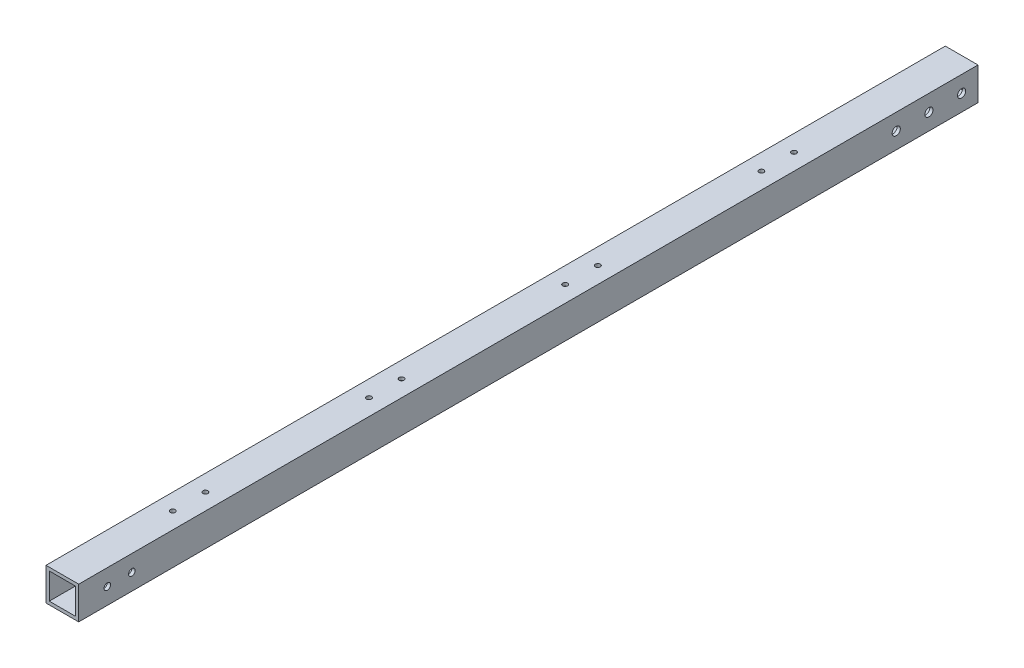
ISO-10303-21;
HEADER;
FILE_DESCRIPTION(('STEP AP214'),'2;1');
FILE_NAME('part.step','',(''),(''),'','','');
FILE_SCHEMA(('AUTOMOTIVE_DESIGN { 1 0 10303 214 1 1 1 1 }'));
ENDSEC;
DATA;
#1=APPLICATION_CONTEXT('core data for automotive mechanical design processes');
#2=APPLICATION_PROTOCOL_DEFINITION('international standard','automotive_design',2000,#1);
#3=PRODUCT_CONTEXT('',#1,'mechanical');
#4=PRODUCT('Part','Part','',(#3));
#5=PRODUCT_RELATED_PRODUCT_CATEGORY('part','',(#4));
#6=PRODUCT_DEFINITION_FORMATION('','',#4);
#7=PRODUCT_DEFINITION_CONTEXT('part definition',#1,'design');
#8=PRODUCT_DEFINITION('design','',#6,#7);
#9=PRODUCT_DEFINITION_SHAPE('','',#8);
#10=(LENGTH_UNIT() NAMED_UNIT(*) SI_UNIT(.MILLI.,.METRE.));
#11=(NAMED_UNIT(*) PLANE_ANGLE_UNIT() SI_UNIT($,.RADIAN.));
#12=(NAMED_UNIT(*) SI_UNIT($,.STERADIAN.) SOLID_ANGLE_UNIT());
#13=UNCERTAINTY_MEASURE_WITH_UNIT(LENGTH_MEASURE(1.E-05),#10,'distance_accuracy_value','');
#14=(GEOMETRIC_REPRESENTATION_CONTEXT(3) GLOBAL_UNCERTAINTY_ASSIGNED_CONTEXT((#13)) GLOBAL_UNIT_ASSIGNED_CONTEXT((#10,
#11,#12)) REPRESENTATION_CONTEXT('',''));
#15=CARTESIAN_POINT('',(0.,0.,0.));
#16=DIRECTION('',(0.,0.,1.));
#17=DIRECTION('',(1.,0.,0.));
#18=AXIS2_PLACEMENT_3D('',#15,#16,#17);
#19=CARTESIAN_POINT('',(0.,0.,550.));
#20=DIRECTION('',(0.,0.,-1.));
#21=DIRECTION('',(-1.,0.,0.));
#22=AXIS2_PLACEMENT_3D('',#19,#20,#21);
#23=PLANE('',#22);
#24=DIRECTION('',(0.,1.,0.));
#25=VECTOR('',#24,1.);
#26=CARTESIAN_POINT('',(10.,-10.,550.));
#27=LINE('',#26,#25);
#28=CARTESIAN_POINT('',(10.,-10.,550.));
#29=VERTEX_POINT('',#28);
#30=CARTESIAN_POINT('',(10.,10.,550.));
#31=VERTEX_POINT('',#30);
#32=EDGE_CURVE('E156',#29,#31,#27,.T.);
#33=ORIENTED_EDGE('',*,*,#32,.T.);
#34=DIRECTION('',(-1.,0.,0.));
#35=VECTOR('',#34,1.);
#36=CARTESIAN_POINT('',(-10.,10.,550.));
#37=LINE('',#36,#35);
#38=CARTESIAN_POINT('',(-10.,10.,550.));
#39=VERTEX_POINT('',#38);
#40=EDGE_CURVE('E160',#31,#39,#37,.T.);
#41=ORIENTED_EDGE('',*,*,#40,.T.);
#42=DIRECTION('',(0.,-1.,0.));
#43=VECTOR('',#42,1.);
#44=CARTESIAN_POINT('',(-10.,-10.,550.));
#45=LINE('',#44,#43);
#46=CARTESIAN_POINT('',(-10.,-10.,550.));
#47=VERTEX_POINT('',#46);
#48=EDGE_CURVE('E164',#39,#47,#45,.T.);
#49=ORIENTED_EDGE('',*,*,#48,.T.);
#50=DIRECTION('',(1.,0.,0.));
#51=VECTOR('',#50,1.);
#52=CARTESIAN_POINT('',(-10.,-10.,550.));
#53=LINE('',#52,#51);
#54=EDGE_CURVE('E167',#47,#29,#53,.T.);
#55=ORIENTED_EDGE('',*,*,#54,.T.);
#56=EDGE_LOOP('',(#33,#41,#49,#55));
#57=FACE_BOUND('',#56,.T.);
#58=DIRECTION('',(0.,1.,0.));
#59=VECTOR('',#58,1.);
#60=CARTESIAN_POINT('',(8.,-8.,550.));
#61=LINE('',#60,#59);
#62=CARTESIAN_POINT('',(8.,-8.,550.));
#63=VERTEX_POINT('',#62);
#64=CARTESIAN_POINT('',(8.,8.,550.));
#65=VERTEX_POINT('',#64);
#66=EDGE_CURVE('E106',#63,#65,#61,.T.);
#67=ORIENTED_EDGE('',*,*,#66,.F.);
#68=DIRECTION('',(1.,0.,0.));
#69=VECTOR('',#68,1.);
#70=CARTESIAN_POINT('',(-8.,-8.,550.));
#71=LINE('',#70,#69);
#72=CARTESIAN_POINT('',(-8.,-8.,550.));
#73=VERTEX_POINT('',#72);
#74=EDGE_CURVE('E132',#73,#63,#71,.T.);
#75=ORIENTED_EDGE('',*,*,#74,.F.);
#76=DIRECTION('',(0.,-1.,0.));
#77=VECTOR('',#76,1.);
#78=CARTESIAN_POINT('',(-8.,-8.,550.));
#79=LINE('',#78,#77);
#80=CARTESIAN_POINT('',(-8.,8.,550.));
#81=VERTEX_POINT('',#80);
#82=EDGE_CURVE('E128',#81,#73,#79,.T.);
#83=ORIENTED_EDGE('',*,*,#82,.F.);
#84=DIRECTION('',(-1.,0.,0.));
#85=VECTOR('',#84,1.);
#86=CARTESIAN_POINT('',(-8.,8.,550.));
#87=LINE('',#86,#85);
#88=EDGE_CURVE('E115',#65,#81,#87,.T.);
#89=ORIENTED_EDGE('',*,*,#88,.F.);
#90=EDGE_LOOP('',(#67,#75,#83,#89));
#91=FACE_BOUND('',#90,.T.);
#92=ADVANCED_FACE('F38',(#57,#91),#23,.F.);
#93=CARTESIAN_POINT('',(0.,0.,0.));
#94=DIRECTION('',(0.,0.,-1.));
#95=DIRECTION('',(-1.,0.,0.));
#96=AXIS2_PLACEMENT_3D('',#93,#94,#95);
#97=PLANE('',#96);
#98=DIRECTION('',(0.,1.,0.));
#99=VECTOR('',#98,1.);
#100=CARTESIAN_POINT('',(10.,-10.,0.));
#101=LINE('',#100,#99);
#102=CARTESIAN_POINT('',(10.,-10.,0.));
#103=VERTEX_POINT('',#102);
#104=CARTESIAN_POINT('',(10.,10.,0.));
#105=VERTEX_POINT('',#104);
#106=EDGE_CURVE('E124',#103,#105,#101,.T.);
#107=ORIENTED_EDGE('',*,*,#106,.F.);
#108=DIRECTION('',(1.,0.,0.));
#109=VECTOR('',#108,1.);
#110=CARTESIAN_POINT('',(-10.,-10.,0.));
#111=LINE('',#110,#109);
#112=CARTESIAN_POINT('',(-10.,-10.,0.));
#113=VERTEX_POINT('',#112);
#114=EDGE_CURVE('E161',#113,#103,#111,.T.);
#115=ORIENTED_EDGE('',*,*,#114,.F.);
#116=DIRECTION('',(0.,-1.,0.));
#117=VECTOR('',#116,1.);
#118=CARTESIAN_POINT('',(-10.,-10.,0.));
#119=LINE('',#118,#117);
#120=CARTESIAN_POINT('',(-10.,10.,0.));
#121=VERTEX_POINT('',#120);
#122=EDGE_CURVE('E177',#121,#113,#119,.T.);
#123=ORIENTED_EDGE('',*,*,#122,.F.);
#124=DIRECTION('',(-1.,0.,0.));
#125=VECTOR('',#124,1.);
#126=CARTESIAN_POINT('',(-10.,10.,0.));
#127=LINE('',#126,#125);
#128=EDGE_CURVE('E174',#105,#121,#127,.T.);
#129=ORIENTED_EDGE('',*,*,#128,.F.);
#130=EDGE_LOOP('',(#107,#115,#123,#129));
#131=FACE_BOUND('',#130,.T.);
#132=DIRECTION('',(1.,0.,0.));
#133=VECTOR('',#132,1.);
#134=CARTESIAN_POINT('',(-8.,-8.,0.));
#135=LINE('',#134,#133);
#136=CARTESIAN_POINT('',(-8.,-8.,0.));
#137=VERTEX_POINT('',#136);
#138=CARTESIAN_POINT('',(8.,-8.,0.));
#139=VERTEX_POINT('',#138);
#140=EDGE_CURVE('E116',#137,#139,#135,.T.);
#141=ORIENTED_EDGE('',*,*,#140,.T.);
#142=DIRECTION('',(0.,1.,0.));
#143=VECTOR('',#142,1.);
#144=CARTESIAN_POINT('',(8.,-8.,0.));
#145=LINE('',#144,#143);
#146=CARTESIAN_POINT('',(8.,8.,0.));
#147=VERTEX_POINT('',#146);
#148=EDGE_CURVE('E64',#139,#147,#145,.T.);
#149=ORIENTED_EDGE('',*,*,#148,.T.);
#150=DIRECTION('',(-1.,0.,0.));
#151=VECTOR('',#150,1.);
#152=CARTESIAN_POINT('',(-8.,8.,0.));
#153=LINE('',#152,#151);
#154=CARTESIAN_POINT('',(-8.,8.,0.));
#155=VERTEX_POINT('',#154);
#156=EDGE_CURVE('E122',#147,#155,#153,.T.);
#157=ORIENTED_EDGE('',*,*,#156,.T.);
#158=DIRECTION('',(0.,-1.,0.));
#159=VECTOR('',#158,1.);
#160=CARTESIAN_POINT('',(-8.,-8.,0.));
#161=LINE('',#160,#159);
#162=EDGE_CURVE('E143',#155,#137,#161,.T.);
#163=ORIENTED_EDGE('',*,*,#162,.T.);
#164=EDGE_LOOP('',(#141,#149,#157,#163));
#165=FACE_BOUND('',#164,.T.);
#166=ADVANCED_FACE('F343',(#131,#165),#97,.T.);
#167=CARTESIAN_POINT('',(10.,-10.,550.));
#168=DIRECTION('',(-1.,0.,0.));
#169=DIRECTION('',(0.,0.,1.));
#170=AXIS2_PLACEMENT_3D('',#167,#168,#169);
#171=PLANE('',#170);
#172=CARTESIAN_POINT('',(10.,0.,10.));
#173=DIRECTION('',(-1.,0.,0.));
#174=DIRECTION('',(0.,0.,1.));
#175=AXIS2_PLACEMENT_3D('',#172,#173,#174);
#176=CIRCLE('',#175,2.5);
#177=CARTESIAN_POINT('',(10.,0.,12.5));
#178=VERTEX_POINT('',#177);
#179=EDGE_CURVE('E207',#178,#178,#176,.T.);
#180=ORIENTED_EDGE('',*,*,#179,.T.);
#181=EDGE_LOOP('',(#180));
#182=FACE_BOUND('',#181,.T.);
#183=CARTESIAN_POINT('',(10.,0.,30.));
#184=DIRECTION('',(-1.,0.,0.));
#185=DIRECTION('',(0.,0.,1.));
#186=AXIS2_PLACEMENT_3D('',#183,#184,#185);
#187=CIRCLE('',#186,2.5);
#188=CARTESIAN_POINT('',(10.,0.,32.5));
#189=VERTEX_POINT('',#188);
#190=EDGE_CURVE('E277',#189,#189,#187,.T.);
#191=ORIENTED_EDGE('',*,*,#190,.T.);
#192=EDGE_LOOP('',(#191));
#193=FACE_BOUND('',#192,.T.);
#194=CARTESIAN_POINT('',(10.,0.,50.));
#195=DIRECTION('',(-1.,0.,0.));
#196=DIRECTION('',(0.,0.,1.));
#197=AXIS2_PLACEMENT_3D('',#194,#195,#196);
#198=CIRCLE('',#197,2.5);
#199=CARTESIAN_POINT('',(10.,0.,52.5));
#200=VERTEX_POINT('',#199);
#201=EDGE_CURVE('E285',#200,#200,#198,.T.);
#202=ORIENTED_EDGE('',*,*,#201,.T.);
#203=EDGE_LOOP('',(#202));
#204=FACE_BOUND('',#203,.T.);
#205=CARTESIAN_POINT('',(10.,0.,532.5));
#206=DIRECTION('',(-1.,0.,0.));
#207=DIRECTION('',(0.,0.,1.));
#208=AXIS2_PLACEMENT_3D('',#205,#206,#207);
#209=CIRCLE('',#208,2.);
#210=CARTESIAN_POINT('',(10.,0.,534.5));
#211=VERTEX_POINT('',#210);
#212=EDGE_CURVE('E197',#211,#211,#209,.T.);
#213=ORIENTED_EDGE('',*,*,#212,.T.);
#214=EDGE_LOOP('',(#213));
#215=FACE_BOUND('',#214,.T.);
#216=CARTESIAN_POINT('',(10.,0.,517.5));
#217=DIRECTION('',(-1.,0.,0.));
#218=DIRECTION('',(0.,0.,1.));
#219=AXIS2_PLACEMENT_3D('',#216,#217,#218);
#220=CIRCLE('',#219,2.);
#221=CARTESIAN_POINT('',(10.,0.,519.5));
#222=VERTEX_POINT('',#221);
#223=EDGE_CURVE('E309',#222,#222,#220,.T.);
#224=ORIENTED_EDGE('',*,*,#223,.T.);
#225=EDGE_LOOP('',(#224));
#226=FACE_BOUND('',#225,.T.);
#227=ORIENTED_EDGE('',*,*,#106,.T.);
#228=DIRECTION('',(0.,0.,-1.));
#229=VECTOR('',#228,1.);
#230=CARTESIAN_POINT('',(10.,10.,550.));
#231=LINE('',#230,#229);
#232=EDGE_CURVE('E11',#31,#105,#231,.T.);
#233=ORIENTED_EDGE('',*,*,#232,.F.);
#234=ORIENTED_EDGE('',*,*,#32,.F.);
#235=DIRECTION('',(0.,0.,-1.));
#236=VECTOR('',#235,1.);
#237=CARTESIAN_POINT('',(10.,-10.,550.));
#238=LINE('',#237,#236);
#239=EDGE_CURVE('E170',#29,#103,#238,.T.);
#240=ORIENTED_EDGE('',*,*,#239,.T.);
#241=EDGE_LOOP('',(#227,#233,#234,#240));
#242=FACE_BOUND('',#241,.T.);
#243=ADVANCED_FACE('F40',(#182,#193,#204,#215,#226,#242),#171,.F.);
#244=CARTESIAN_POINT('',(-10.,10.,550.));
#245=DIRECTION('',(0.,-1.,0.));
#246=DIRECTION('',(0.,0.,-1.));
#247=AXIS2_PLACEMENT_3D('',#244,#245,#246);
#248=PLANE('',#247);
#249=CARTESIAN_POINT('',(0.,10.,482.5));
#250=DIRECTION('',(0.,-1.,0.));
#251=DIRECTION('',(0.,0.,-1.));
#252=AXIS2_PLACEMENT_3D('',#249,#250,#251);
#253=CIRCLE('',#252,1.5);
#254=CARTESIAN_POINT('',(0.,10.,481.));
#255=VERTEX_POINT('',#254);
#256=EDGE_CURVE('E223',#255,#255,#253,.T.);
#257=ORIENTED_EDGE('',*,*,#256,.T.);
#258=EDGE_LOOP('',(#257));
#259=FACE_BOUND('',#258,.T.);
#260=CARTESIAN_POINT('',(0.,10.,462.5));
#261=DIRECTION('',(0.,-1.,0.));
#262=DIRECTION('',(0.,0.,-1.));
#263=AXIS2_PLACEMENT_3D('',#260,#261,#262);
#264=CIRCLE('',#263,1.5);
#265=CARTESIAN_POINT('',(0.,10.,461.));
#266=VERTEX_POINT('',#265);
#267=EDGE_CURVE('E471',#266,#266,#264,.T.);
#268=ORIENTED_EDGE('',*,*,#267,.T.);
#269=EDGE_LOOP('',(#268));
#270=FACE_BOUND('',#269,.T.);
#271=CARTESIAN_POINT('',(0.,10.,362.5));
#272=DIRECTION('',(0.,-1.,0.));
#273=DIRECTION('',(0.,0.,-1.));
#274=AXIS2_PLACEMENT_3D('',#271,#272,#273);
#275=CIRCLE('',#274,1.5);
#276=CARTESIAN_POINT('',(0.,10.,361.));
#277=VERTEX_POINT('',#276);
#278=EDGE_CURVE('E481',#277,#277,#275,.T.);
#279=ORIENTED_EDGE('',*,*,#278,.T.);
#280=EDGE_LOOP('',(#279));
#281=FACE_BOUND('',#280,.T.);
#282=CARTESIAN_POINT('',(0.,10.,342.5));
#283=DIRECTION('',(0.,-1.,0.));
#284=DIRECTION('',(0.,0.,-1.));
#285=AXIS2_PLACEMENT_3D('',#282,#283,#284);
#286=CIRCLE('',#285,1.5);
#287=CARTESIAN_POINT('',(0.,10.,341.));
#288=VERTEX_POINT('',#287);
#289=EDGE_CURVE('E489',#288,#288,#286,.T.);
#290=ORIENTED_EDGE('',*,*,#289,.T.);
#291=EDGE_LOOP('',(#290));
#292=FACE_BOUND('',#291,.T.);
#293=CARTESIAN_POINT('',(0.,10.,242.5));
#294=DIRECTION('',(0.,-1.,0.));
#295=DIRECTION('',(0.,0.,-1.));
#296=AXIS2_PLACEMENT_3D('',#293,#294,#295);
#297=CIRCLE('',#296,1.5);
#298=CARTESIAN_POINT('',(0.,10.,241.));
#299=VERTEX_POINT('',#298);
#300=EDGE_CURVE('E497',#299,#299,#297,.T.);
#301=ORIENTED_EDGE('',*,*,#300,.T.);
#302=EDGE_LOOP('',(#301));
#303=FACE_BOUND('',#302,.T.);
#304=CARTESIAN_POINT('',(0.,10.,222.5));
#305=DIRECTION('',(0.,-1.,0.));
#306=DIRECTION('',(0.,0.,-1.));
#307=AXIS2_PLACEMENT_3D('',#304,#305,#306);
#308=CIRCLE('',#307,1.5);
#309=CARTESIAN_POINT('',(0.,10.,221.));
#310=VERTEX_POINT('',#309);
#311=EDGE_CURVE('E505',#310,#310,#308,.T.);
#312=ORIENTED_EDGE('',*,*,#311,.T.);
#313=EDGE_LOOP('',(#312));
#314=FACE_BOUND('',#313,.T.);
#315=CARTESIAN_POINT('',(0.,10.,122.5));
#316=DIRECTION('',(0.,-1.,0.));
#317=DIRECTION('',(0.,0.,-1.));
#318=AXIS2_PLACEMENT_3D('',#315,#316,#317);
#319=CIRCLE('',#318,1.5);
#320=CARTESIAN_POINT('',(0.,10.,121.));
#321=VERTEX_POINT('',#320);
#322=EDGE_CURVE('E513',#321,#321,#319,.T.);
#323=ORIENTED_EDGE('',*,*,#322,.T.);
#324=EDGE_LOOP('',(#323));
#325=FACE_BOUND('',#324,.T.);
#326=CARTESIAN_POINT('',(0.,10.,102.5));
#327=DIRECTION('',(0.,-1.,0.));
#328=DIRECTION('',(0.,0.,-1.));
#329=AXIS2_PLACEMENT_3D('',#326,#327,#328);
#330=CIRCLE('',#329,1.5);
#331=CARTESIAN_POINT('',(0.,10.,101.));
#332=VERTEX_POINT('',#331);
#333=EDGE_CURVE('E521',#332,#332,#330,.T.);
#334=ORIENTED_EDGE('',*,*,#333,.T.);
#335=EDGE_LOOP('',(#334));
#336=FACE_BOUND('',#335,.T.);
#337=ORIENTED_EDGE('',*,*,#128,.T.);
#338=DIRECTION('',(0.,0.,-1.));
#339=VECTOR('',#338,1.);
#340=CARTESIAN_POINT('',(-10.,10.,550.));
#341=LINE('',#340,#339);
#342=EDGE_CURVE('E48',#39,#121,#341,.T.);
#343=ORIENTED_EDGE('',*,*,#342,.F.);
#344=ORIENTED_EDGE('',*,*,#40,.F.);
#345=ORIENTED_EDGE('',*,*,#232,.T.);
#346=EDGE_LOOP('',(#337,#343,#344,#345));
#347=FACE_BOUND('',#346,.T.);
#348=ADVANCED_FACE('F342',(#259,#270,#281,#292,#303,#314,#325,#336,#347),#248,.F.);
#349=CARTESIAN_POINT('',(-10.,-10.,550.));
#350=DIRECTION('',(1.,0.,0.));
#351=DIRECTION('',(0.,0.,-1.));
#352=AXIS2_PLACEMENT_3D('',#349,#350,#351);
#353=PLANE('',#352);
#354=CARTESIAN_POINT('',(-10.,0.,10.));
#355=DIRECTION('',(-1.,0.,0.));
#356=DIRECTION('',(0.,0.,1.));
#357=AXIS2_PLACEMENT_3D('',#354,#355,#356);
#358=CIRCLE('',#357,2.5);
#359=CARTESIAN_POINT('',(-10.,0.,12.5));
#360=VERTEX_POINT('',#359);
#361=EDGE_CURVE('E273',#360,#360,#358,.T.);
#362=ORIENTED_EDGE('',*,*,#361,.F.);
#363=EDGE_LOOP('',(#362));
#364=FACE_BOUND('',#363,.T.);
#365=CARTESIAN_POINT('',(-10.,0.,30.));
#366=DIRECTION('',(-1.,0.,0.));
#367=DIRECTION('',(0.,0.,1.));
#368=AXIS2_PLACEMENT_3D('',#365,#366,#367);
#369=CIRCLE('',#368,2.5);
#370=CARTESIAN_POINT('',(-10.,0.,32.5));
#371=VERTEX_POINT('',#370);
#372=EDGE_CURVE('E281',#371,#371,#369,.T.);
#373=ORIENTED_EDGE('',*,*,#372,.F.);
#374=EDGE_LOOP('',(#373));
#375=FACE_BOUND('',#374,.T.);
#376=CARTESIAN_POINT('',(-10.,0.,50.));
#377=DIRECTION('',(-1.,0.,0.));
#378=DIRECTION('',(0.,0.,1.));
#379=AXIS2_PLACEMENT_3D('',#376,#377,#378);
#380=CIRCLE('',#379,2.5);
#381=CARTESIAN_POINT('',(-10.,0.,52.5));
#382=VERTEX_POINT('',#381);
#383=EDGE_CURVE('E269',#382,#382,#380,.T.);
#384=ORIENTED_EDGE('',*,*,#383,.F.);
#385=EDGE_LOOP('',(#384));
#386=FACE_BOUND('',#385,.T.);
#387=CARTESIAN_POINT('',(-10.,0.,532.5));
#388=DIRECTION('',(-1.,0.,0.));
#389=DIRECTION('',(0.,0.,1.));
#390=AXIS2_PLACEMENT_3D('',#387,#388,#389);
#391=CIRCLE('',#390,2.);
#392=CARTESIAN_POINT('',(-10.,0.,534.5));
#393=VERTEX_POINT('',#392);
#394=EDGE_CURVE('E305',#393,#393,#391,.T.);
#395=ORIENTED_EDGE('',*,*,#394,.F.);
#396=EDGE_LOOP('',(#395));
#397=FACE_BOUND('',#396,.T.);
#398=CARTESIAN_POINT('',(-10.,0.,517.5));
#399=DIRECTION('',(-1.,0.,0.));
#400=DIRECTION('',(0.,0.,1.));
#401=AXIS2_PLACEMENT_3D('',#398,#399,#400);
#402=CIRCLE('',#401,2.);
#403=CARTESIAN_POINT('',(-10.,0.,519.5));
#404=VERTEX_POINT('',#403);
#405=EDGE_CURVE('E301',#404,#404,#402,.T.);
#406=ORIENTED_EDGE('',*,*,#405,.F.);
#407=EDGE_LOOP('',(#406));
#408=FACE_BOUND('',#407,.T.);
#409=ORIENTED_EDGE('',*,*,#122,.T.);
#410=DIRECTION('',(0.,0.,-1.));
#411=VECTOR('',#410,1.);
#412=CARTESIAN_POINT('',(-10.,-10.,550.));
#413=LINE('',#412,#411);
#414=EDGE_CURVE('E185',#47,#113,#413,.T.);
#415=ORIENTED_EDGE('',*,*,#414,.F.);
#416=ORIENTED_EDGE('',*,*,#48,.F.);
#417=ORIENTED_EDGE('',*,*,#342,.T.);
#418=EDGE_LOOP('',(#409,#415,#416,#417));
#419=FACE_BOUND('',#418,.T.);
#420=ADVANCED_FACE('F361',(#364,#375,#386,#397,#408,#419),#353,.F.);
#421=CARTESIAN_POINT('',(-10.,-10.,550.));
#422=DIRECTION('',(0.,1.,0.));
#423=DIRECTION('',(0.,0.,1.));
#424=AXIS2_PLACEMENT_3D('',#421,#422,#423);
#425=PLANE('',#424);
#426=CARTESIAN_POINT('',(0.,-10.,482.5));
#427=DIRECTION('',(0.,-1.,0.));
#428=DIRECTION('',(0.,0.,-1.));
#429=AXIS2_PLACEMENT_3D('',#426,#427,#428);
#430=CIRCLE('',#429,1.5);
#431=CARTESIAN_POINT('',(0.,-10.,481.));
#432=VERTEX_POINT('',#431);
#433=EDGE_CURVE('E467',#432,#432,#430,.T.);
#434=ORIENTED_EDGE('',*,*,#433,.F.);
#435=EDGE_LOOP('',(#434));
#436=FACE_BOUND('',#435,.T.);
#437=CARTESIAN_POINT('',(0.,-10.,462.5));
#438=DIRECTION('',(0.,-1.,0.));
#439=DIRECTION('',(0.,0.,-1.));
#440=AXIS2_PLACEMENT_3D('',#437,#438,#439);
#441=CIRCLE('',#440,1.5);
#442=CARTESIAN_POINT('',(0.,-10.,461.));
#443=VERTEX_POINT('',#442);
#444=EDGE_CURVE('E477',#443,#443,#441,.T.);
#445=ORIENTED_EDGE('',*,*,#444,.F.);
#446=EDGE_LOOP('',(#445));
#447=FACE_BOUND('',#446,.T.);
#448=CARTESIAN_POINT('',(0.,-10.,362.5));
#449=DIRECTION('',(0.,-1.,0.));
#450=DIRECTION('',(0.,0.,-1.));
#451=AXIS2_PLACEMENT_3D('',#448,#449,#450);
#452=CIRCLE('',#451,1.5);
#453=CARTESIAN_POINT('',(0.,-10.,361.));
#454=VERTEX_POINT('',#453);
#455=EDGE_CURVE('E485',#454,#454,#452,.T.);
#456=ORIENTED_EDGE('',*,*,#455,.F.);
#457=EDGE_LOOP('',(#456));
#458=FACE_BOUND('',#457,.T.);
#459=CARTESIAN_POINT('',(0.,-10.,342.5));
#460=DIRECTION('',(0.,-1.,0.));
#461=DIRECTION('',(0.,0.,-1.));
#462=AXIS2_PLACEMENT_3D('',#459,#460,#461);
#463=CIRCLE('',#462,1.5);
#464=CARTESIAN_POINT('',(0.,-10.,341.));
#465=VERTEX_POINT('',#464);
#466=EDGE_CURVE('E493',#465,#465,#463,.T.);
#467=ORIENTED_EDGE('',*,*,#466,.F.);
#468=EDGE_LOOP('',(#467));
#469=FACE_BOUND('',#468,.T.);
#470=CARTESIAN_POINT('',(0.,-10.,242.5));
#471=DIRECTION('',(0.,-1.,0.));
#472=DIRECTION('',(0.,0.,-1.));
#473=AXIS2_PLACEMENT_3D('',#470,#471,#472);
#474=CIRCLE('',#473,1.5);
#475=CARTESIAN_POINT('',(0.,-10.,241.));
#476=VERTEX_POINT('',#475);
#477=EDGE_CURVE('E501',#476,#476,#474,.T.);
#478=ORIENTED_EDGE('',*,*,#477,.F.);
#479=EDGE_LOOP('',(#478));
#480=FACE_BOUND('',#479,.T.);
#481=CARTESIAN_POINT('',(0.,-10.,222.5));
#482=DIRECTION('',(0.,-1.,0.));
#483=DIRECTION('',(0.,0.,-1.));
#484=AXIS2_PLACEMENT_3D('',#481,#482,#483);
#485=CIRCLE('',#484,1.5);
#486=CARTESIAN_POINT('',(0.,-10.,221.));
#487=VERTEX_POINT('',#486);
#488=EDGE_CURVE('E509',#487,#487,#485,.T.);
#489=ORIENTED_EDGE('',*,*,#488,.F.);
#490=EDGE_LOOP('',(#489));
#491=FACE_BOUND('',#490,.T.);
#492=CARTESIAN_POINT('',(0.,-10.,122.5));
#493=DIRECTION('',(0.,-1.,0.));
#494=DIRECTION('',(0.,0.,-1.));
#495=AXIS2_PLACEMENT_3D('',#492,#493,#494);
#496=CIRCLE('',#495,1.5);
#497=CARTESIAN_POINT('',(0.,-10.,121.));
#498=VERTEX_POINT('',#497);
#499=EDGE_CURVE('E517',#498,#498,#496,.T.);
#500=ORIENTED_EDGE('',*,*,#499,.F.);
#501=EDGE_LOOP('',(#500));
#502=FACE_BOUND('',#501,.T.);
#503=CARTESIAN_POINT('',(0.,-10.,102.5));
#504=DIRECTION('',(0.,-1.,0.));
#505=DIRECTION('',(0.,0.,-1.));
#506=AXIS2_PLACEMENT_3D('',#503,#504,#505);
#507=CIRCLE('',#506,1.5);
#508=CARTESIAN_POINT('',(0.,-10.,101.));
#509=VERTEX_POINT('',#508);
#510=EDGE_CURVE('E525',#509,#509,#507,.T.);
#511=ORIENTED_EDGE('',*,*,#510,.F.);
#512=EDGE_LOOP('',(#511));
#513=FACE_BOUND('',#512,.T.);
#514=ORIENTED_EDGE('',*,*,#114,.T.);
#515=ORIENTED_EDGE('',*,*,#239,.F.);
#516=ORIENTED_EDGE('',*,*,#54,.F.);
#517=ORIENTED_EDGE('',*,*,#414,.T.);
#518=EDGE_LOOP('',(#514,#515,#516,#517));
#519=FACE_BOUND('',#518,.T.);
#520=ADVANCED_FACE('F327',(#436,#447,#458,#469,#480,#491,#502,#513,#519),#425,.F.);
#521=CARTESIAN_POINT('',(8.,-8.,550.));
#522=DIRECTION('',(-1.,0.,0.));
#523=DIRECTION('',(0.,0.,1.));
#524=AXIS2_PLACEMENT_3D('',#521,#522,#523);
#525=PLANE('',#524);
#526=CARTESIAN_POINT('',(8.,0.,10.));
#527=DIRECTION('',(-1.,0.,0.));
#528=DIRECTION('',(0.,0.,1.));
#529=AXIS2_PLACEMENT_3D('',#526,#527,#528);
#530=CIRCLE('',#529,2.5);
#531=CARTESIAN_POINT('',(8.,0.,12.5));
#532=VERTEX_POINT('',#531);
#533=EDGE_CURVE('E217',#532,#532,#530,.T.);
#534=ORIENTED_EDGE('',*,*,#533,.F.);
#535=EDGE_LOOP('',(#534));
#536=FACE_BOUND('',#535,.T.);
#537=CARTESIAN_POINT('',(8.,0.,30.));
#538=DIRECTION('',(-1.,0.,0.));
#539=DIRECTION('',(0.,0.,1.));
#540=AXIS2_PLACEMENT_3D('',#537,#538,#539);
#541=CIRCLE('',#540,2.5);
#542=CARTESIAN_POINT('',(8.,0.,32.5));
#543=VERTEX_POINT('',#542);
#544=EDGE_CURVE('E212',#543,#543,#541,.T.);
#545=ORIENTED_EDGE('',*,*,#544,.F.);
#546=EDGE_LOOP('',(#545));
#547=FACE_BOUND('',#546,.T.);
#548=CARTESIAN_POINT('',(8.,0.,50.));
#549=DIRECTION('',(-1.,0.,0.));
#550=DIRECTION('',(0.,0.,1.));
#551=AXIS2_PLACEMENT_3D('',#548,#549,#550);
#552=CIRCLE('',#551,2.5);
#553=CARTESIAN_POINT('',(8.,0.,52.5));
#554=VERTEX_POINT('',#553);
#555=EDGE_CURVE('E206',#554,#554,#552,.T.);
#556=ORIENTED_EDGE('',*,*,#555,.F.);
#557=EDGE_LOOP('',(#556));
#558=FACE_BOUND('',#557,.T.);
#559=CARTESIAN_POINT('',(8.,0.,532.5));
#560=DIRECTION('',(-1.,0.,0.));
#561=DIRECTION('',(0.,0.,1.));
#562=AXIS2_PLACEMENT_3D('',#559,#560,#561);
#563=CIRCLE('',#562,2.);
#564=CARTESIAN_POINT('',(8.,0.,534.5));
#565=VERTEX_POINT('',#564);
#566=EDGE_CURVE('E140',#565,#565,#563,.T.);
#567=ORIENTED_EDGE('',*,*,#566,.F.);
#568=EDGE_LOOP('',(#567));
#569=FACE_BOUND('',#568,.T.);
#570=CARTESIAN_POINT('',(8.,0.,517.5));
#571=DIRECTION('',(-1.,0.,0.));
#572=DIRECTION('',(0.,0.,1.));
#573=AXIS2_PLACEMENT_3D('',#570,#571,#572);
#574=CIRCLE('',#573,2.);
#575=CARTESIAN_POINT('',(8.,0.,519.5));
#576=VERTEX_POINT('',#575);
#577=EDGE_CURVE('E196',#576,#576,#574,.T.);
#578=ORIENTED_EDGE('',*,*,#577,.F.);
#579=EDGE_LOOP('',(#578));
#580=FACE_BOUND('',#579,.T.);
#581=ORIENTED_EDGE('',*,*,#148,.F.);
#582=DIRECTION('',(0.,0.,-1.));
#583=VECTOR('',#582,1.);
#584=CARTESIAN_POINT('',(8.,-8.,550.));
#585=LINE('',#584,#583);
#586=EDGE_CURVE('E110',#63,#139,#585,.T.);
#587=ORIENTED_EDGE('',*,*,#586,.F.);
#588=ORIENTED_EDGE('',*,*,#66,.T.);
#589=DIRECTION('',(0.,0.,-1.));
#590=VECTOR('',#589,1.);
#591=CARTESIAN_POINT('',(8.,8.,550.));
#592=LINE('',#591,#590);
#593=EDGE_CURVE('E109',#65,#147,#592,.T.);
#594=ORIENTED_EDGE('',*,*,#593,.T.);
#595=EDGE_LOOP('',(#581,#587,#588,#594));
#596=FACE_BOUND('',#595,.T.);
#597=ADVANCED_FACE('F108',(#536,#547,#558,#569,#580,#596),#525,.T.);
#598=CARTESIAN_POINT('',(-8.,8.,550.));
#599=DIRECTION('',(0.,-1.,0.));
#600=DIRECTION('',(0.,0.,-1.));
#601=AXIS2_PLACEMENT_3D('',#598,#599,#600);
#602=PLANE('',#601);
#603=CARTESIAN_POINT('',(0.,8.,482.5));
#604=DIRECTION('',(0.,-1.,0.));
#605=DIRECTION('',(0.,0.,-1.));
#606=AXIS2_PLACEMENT_3D('',#603,#604,#605);
#607=CIRCLE('',#606,1.5);
#608=CARTESIAN_POINT('',(0.,8.,481.));
#609=VERTEX_POINT('',#608);
#610=EDGE_CURVE('E265',#609,#609,#607,.T.);
#611=ORIENTED_EDGE('',*,*,#610,.F.);
#612=EDGE_LOOP('',(#611));
#613=FACE_BOUND('',#612,.T.);
#614=CARTESIAN_POINT('',(0.,8.,462.5));
#615=DIRECTION('',(0.,-1.,0.));
#616=DIRECTION('',(0.,0.,-1.));
#617=AXIS2_PLACEMENT_3D('',#614,#615,#616);
#618=CIRCLE('',#617,1.5);
#619=CARTESIAN_POINT('',(0.,8.,461.));
#620=VERTEX_POINT('',#619);
#621=EDGE_CURVE('E251',#620,#620,#618,.T.);
#622=ORIENTED_EDGE('',*,*,#621,.F.);
#623=EDGE_LOOP('',(#622));
#624=FACE_BOUND('',#623,.T.);
#625=CARTESIAN_POINT('',(0.,8.,362.5));
#626=DIRECTION('',(0.,-1.,0.));
#627=DIRECTION('',(0.,0.,-1.));
#628=AXIS2_PLACEMENT_3D('',#625,#626,#627);
#629=CIRCLE('',#628,1.5);
#630=CARTESIAN_POINT('',(0.,8.,361.));
#631=VERTEX_POINT('',#630);
#632=EDGE_CURVE('E247',#631,#631,#629,.T.);
#633=ORIENTED_EDGE('',*,*,#632,.F.);
#634=EDGE_LOOP('',(#633));
#635=FACE_BOUND('',#634,.T.);
#636=CARTESIAN_POINT('',(0.,8.,342.5));
#637=DIRECTION('',(0.,-1.,0.));
#638=DIRECTION('',(0.,0.,-1.));
#639=AXIS2_PLACEMENT_3D('',#636,#637,#638);
#640=CIRCLE('',#639,1.5);
#641=CARTESIAN_POINT('',(0.,8.,341.));
#642=VERTEX_POINT('',#641);
#643=EDGE_CURVE('E243',#642,#642,#640,.T.);
#644=ORIENTED_EDGE('',*,*,#643,.F.);
#645=EDGE_LOOP('',(#644));
#646=FACE_BOUND('',#645,.T.);
#647=CARTESIAN_POINT('',(0.,8.,242.5));
#648=DIRECTION('',(0.,-1.,0.));
#649=DIRECTION('',(0.,0.,-1.));
#650=AXIS2_PLACEMENT_3D('',#647,#648,#649);
#651=CIRCLE('',#650,1.5);
#652=CARTESIAN_POINT('',(0.,8.,241.));
#653=VERTEX_POINT('',#652);
#654=EDGE_CURVE('E238',#653,#653,#651,.T.);
#655=ORIENTED_EDGE('',*,*,#654,.F.);
#656=EDGE_LOOP('',(#655));
#657=FACE_BOUND('',#656,.T.);
#658=CARTESIAN_POINT('',(0.,8.,222.5));
#659=DIRECTION('',(0.,-1.,0.));
#660=DIRECTION('',(0.,0.,-1.));
#661=AXIS2_PLACEMENT_3D('',#658,#659,#660);
#662=CIRCLE('',#661,1.5);
#663=CARTESIAN_POINT('',(0.,8.,221.));
#664=VERTEX_POINT('',#663);
#665=EDGE_CURVE('E233',#664,#664,#662,.T.);
#666=ORIENTED_EDGE('',*,*,#665,.F.);
#667=EDGE_LOOP('',(#666));
#668=FACE_BOUND('',#667,.T.);
#669=CARTESIAN_POINT('',(0.,8.,122.5));
#670=DIRECTION('',(0.,-1.,0.));
#671=DIRECTION('',(0.,0.,-1.));
#672=AXIS2_PLACEMENT_3D('',#669,#670,#671);
#673=CIRCLE('',#672,1.5);
#674=CARTESIAN_POINT('',(0.,8.,121.));
#675=VERTEX_POINT('',#674);
#676=EDGE_CURVE('E228',#675,#675,#673,.T.);
#677=ORIENTED_EDGE('',*,*,#676,.F.);
#678=EDGE_LOOP('',(#677));
#679=FACE_BOUND('',#678,.T.);
#680=CARTESIAN_POINT('',(0.,8.,102.5));
#681=DIRECTION('',(0.,-1.,0.));
#682=DIRECTION('',(0.,0.,-1.));
#683=AXIS2_PLACEMENT_3D('',#680,#681,#682);
#684=CIRCLE('',#683,1.5);
#685=CARTESIAN_POINT('',(0.,8.,101.));
#686=VERTEX_POINT('',#685);
#687=EDGE_CURVE('E222',#686,#686,#684,.T.);
#688=ORIENTED_EDGE('',*,*,#687,.F.);
#689=EDGE_LOOP('',(#688));
#690=FACE_BOUND('',#689,.T.);
#691=ORIENTED_EDGE('',*,*,#156,.F.);
#692=ORIENTED_EDGE('',*,*,#593,.F.);
#693=ORIENTED_EDGE('',*,*,#88,.T.);
#694=DIRECTION('',(0.,0.,-1.));
#695=VECTOR('',#694,1.);
#696=CARTESIAN_POINT('',(-8.,8.,550.));
#697=LINE('',#696,#695);
#698=EDGE_CURVE('E125',#81,#155,#697,.T.);
#699=ORIENTED_EDGE('',*,*,#698,.T.);
#700=EDGE_LOOP('',(#691,#692,#693,#699));
#701=FACE_BOUND('',#700,.T.);
#702=ADVANCED_FACE('F119',(#613,#624,#635,#646,#657,#668,#679,#690,#701),#602,.T.);
#703=CARTESIAN_POINT('',(-8.,-8.,550.));
#704=DIRECTION('',(1.,0.,0.));
#705=DIRECTION('',(0.,0.,-1.));
#706=AXIS2_PLACEMENT_3D('',#703,#704,#705);
#707=PLANE('',#706);
#708=CARTESIAN_POINT('',(-8.,0.,10.));
#709=DIRECTION('',(1.,0.,0.));
#710=DIRECTION('',(0.,0.,-1.));
#711=AXIS2_PLACEMENT_3D('',#708,#709,#710);
#712=CIRCLE('',#711,2.5);
#713=CARTESIAN_POINT('',(-8.,0.,7.5));
#714=VERTEX_POINT('',#713);
#715=EDGE_CURVE('E213',#714,#714,#712,.T.);
#716=ORIENTED_EDGE('',*,*,#715,.F.);
#717=EDGE_LOOP('',(#716));
#718=FACE_BOUND('',#717,.T.);
#719=CARTESIAN_POINT('',(-8.,0.,30.));
#720=DIRECTION('',(1.,0.,0.));
#721=DIRECTION('',(0.,0.,-1.));
#722=AXIS2_PLACEMENT_3D('',#719,#720,#721);
#723=CIRCLE('',#722,2.5);
#724=CARTESIAN_POINT('',(-8.,0.,27.5));
#725=VERTEX_POINT('',#724);
#726=EDGE_CURVE('E208',#725,#725,#723,.T.);
#727=ORIENTED_EDGE('',*,*,#726,.F.);
#728=EDGE_LOOP('',(#727));
#729=FACE_BOUND('',#728,.T.);
#730=CARTESIAN_POINT('',(-8.,0.,50.));
#731=DIRECTION('',(1.,0.,0.));
#732=DIRECTION('',(0.,0.,-1.));
#733=AXIS2_PLACEMENT_3D('',#730,#731,#732);
#734=CIRCLE('',#733,2.5);
#735=CARTESIAN_POINT('',(-8.,0.,47.5));
#736=VERTEX_POINT('',#735);
#737=EDGE_CURVE('E202',#736,#736,#734,.T.);
#738=ORIENTED_EDGE('',*,*,#737,.F.);
#739=EDGE_LOOP('',(#738));
#740=FACE_BOUND('',#739,.T.);
#741=CARTESIAN_POINT('',(-8.,0.,532.5));
#742=DIRECTION('',(1.,0.,0.));
#743=DIRECTION('',(0.,0.,-1.));
#744=AXIS2_PLACEMENT_3D('',#741,#742,#743);
#745=CIRCLE('',#744,2.);
#746=CARTESIAN_POINT('',(-8.,0.,530.5));
#747=VERTEX_POINT('',#746);
#748=EDGE_CURVE('E198',#747,#747,#745,.T.);
#749=ORIENTED_EDGE('',*,*,#748,.F.);
#750=EDGE_LOOP('',(#749));
#751=FACE_BOUND('',#750,.T.);
#752=CARTESIAN_POINT('',(-8.,0.,517.5));
#753=DIRECTION('',(1.,0.,0.));
#754=DIRECTION('',(0.,0.,-1.));
#755=AXIS2_PLACEMENT_3D('',#752,#753,#754);
#756=CIRCLE('',#755,2.);
#757=CARTESIAN_POINT('',(-8.,0.,515.5));
#758=VERTEX_POINT('',#757);
#759=EDGE_CURVE('E192',#758,#758,#756,.T.);
#760=ORIENTED_EDGE('',*,*,#759,.F.);
#761=EDGE_LOOP('',(#760));
#762=FACE_BOUND('',#761,.T.);
#763=ORIENTED_EDGE('',*,*,#162,.F.);
#764=ORIENTED_EDGE('',*,*,#698,.F.);
#765=ORIENTED_EDGE('',*,*,#82,.T.);
#766=DIRECTION('',(0.,0.,-1.));
#767=VECTOR('',#766,1.);
#768=CARTESIAN_POINT('',(-8.,-8.,550.));
#769=LINE('',#768,#767);
#770=EDGE_CURVE('E56',#73,#137,#769,.T.);
#771=ORIENTED_EDGE('',*,*,#770,.T.);
#772=EDGE_LOOP('',(#763,#764,#765,#771));
#773=FACE_BOUND('',#772,.T.);
#774=ADVANCED_FACE('F383',(#718,#729,#740,#751,#762,#773),#707,.T.);
#775=CARTESIAN_POINT('',(-8.,-8.,550.));
#776=DIRECTION('',(0.,1.,0.));
#777=DIRECTION('',(0.,0.,1.));
#778=AXIS2_PLACEMENT_3D('',#775,#776,#777);
#779=PLANE('',#778);
#780=CARTESIAN_POINT('',(0.,-8.,482.5));
#781=DIRECTION('',(0.,1.,0.));
#782=DIRECTION('',(0.,0.,1.));
#783=AXIS2_PLACEMENT_3D('',#780,#781,#782);
#784=CIRCLE('',#783,1.5);
#785=CARTESIAN_POINT('',(0.,-8.,484.));
#786=VERTEX_POINT('',#785);
#787=EDGE_CURVE('E42',#786,#786,#784,.T.);
#788=ORIENTED_EDGE('',*,*,#787,.F.);
#789=EDGE_LOOP('',(#788));
#790=FACE_BOUND('',#789,.T.);
#791=CARTESIAN_POINT('',(0.,-8.,462.5));
#792=DIRECTION('',(0.,1.,0.));
#793=DIRECTION('',(0.,0.,1.));
#794=AXIS2_PLACEMENT_3D('',#791,#792,#793);
#795=CIRCLE('',#794,1.5);
#796=CARTESIAN_POINT('',(0.,-8.,464.));
#797=VERTEX_POINT('',#796);
#798=EDGE_CURVE('E248',#797,#797,#795,.T.);
#799=ORIENTED_EDGE('',*,*,#798,.F.);
#800=EDGE_LOOP('',(#799));
#801=FACE_BOUND('',#800,.T.);
#802=CARTESIAN_POINT('',(0.,-8.,362.5));
#803=DIRECTION('',(0.,1.,0.));
#804=DIRECTION('',(0.,0.,1.));
#805=AXIS2_PLACEMENT_3D('',#802,#803,#804);
#806=CIRCLE('',#805,1.5);
#807=CARTESIAN_POINT('',(0.,-8.,364.));
#808=VERTEX_POINT('',#807);
#809=EDGE_CURVE('E244',#808,#808,#806,.T.);
#810=ORIENTED_EDGE('',*,*,#809,.F.);
#811=EDGE_LOOP('',(#810));
#812=FACE_BOUND('',#811,.T.);
#813=CARTESIAN_POINT('',(0.,-8.,342.5));
#814=DIRECTION('',(0.,1.,0.));
#815=DIRECTION('',(0.,0.,1.));
#816=AXIS2_PLACEMENT_3D('',#813,#814,#815);
#817=CIRCLE('',#816,1.5);
#818=CARTESIAN_POINT('',(0.,-8.,344.));
#819=VERTEX_POINT('',#818);
#820=EDGE_CURVE('E239',#819,#819,#817,.T.);
#821=ORIENTED_EDGE('',*,*,#820,.F.);
#822=EDGE_LOOP('',(#821));
#823=FACE_BOUND('',#822,.T.);
#824=CARTESIAN_POINT('',(0.,-8.,242.5));
#825=DIRECTION('',(0.,1.,0.));
#826=DIRECTION('',(0.,0.,1.));
#827=AXIS2_PLACEMENT_3D('',#824,#825,#826);
#828=CIRCLE('',#827,1.5);
#829=CARTESIAN_POINT('',(0.,-8.,244.));
#830=VERTEX_POINT('',#829);
#831=EDGE_CURVE('E234',#830,#830,#828,.T.);
#832=ORIENTED_EDGE('',*,*,#831,.F.);
#833=EDGE_LOOP('',(#832));
#834=FACE_BOUND('',#833,.T.);
#835=CARTESIAN_POINT('',(0.,-8.,222.5));
#836=DIRECTION('',(0.,1.,0.));
#837=DIRECTION('',(0.,0.,1.));
#838=AXIS2_PLACEMENT_3D('',#835,#836,#837);
#839=CIRCLE('',#838,1.5);
#840=CARTESIAN_POINT('',(0.,-8.,224.));
#841=VERTEX_POINT('',#840);
#842=EDGE_CURVE('E229',#841,#841,#839,.T.);
#843=ORIENTED_EDGE('',*,*,#842,.F.);
#844=EDGE_LOOP('',(#843));
#845=FACE_BOUND('',#844,.T.);
#846=CARTESIAN_POINT('',(0.,-8.,122.5));
#847=DIRECTION('',(0.,1.,0.));
#848=DIRECTION('',(0.,0.,1.));
#849=AXIS2_PLACEMENT_3D('',#846,#847,#848);
#850=CIRCLE('',#849,1.5);
#851=CARTESIAN_POINT('',(0.,-8.,124.));
#852=VERTEX_POINT('',#851);
#853=EDGE_CURVE('E224',#852,#852,#850,.T.);
#854=ORIENTED_EDGE('',*,*,#853,.F.);
#855=EDGE_LOOP('',(#854));
#856=FACE_BOUND('',#855,.T.);
#857=CARTESIAN_POINT('',(0.,-8.,102.5));
#858=DIRECTION('',(0.,1.,0.));
#859=DIRECTION('',(0.,0.,1.));
#860=AXIS2_PLACEMENT_3D('',#857,#858,#859);
#861=CIRCLE('',#860,1.5);
#862=CARTESIAN_POINT('',(0.,-8.,104.));
#863=VERTEX_POINT('',#862);
#864=EDGE_CURVE('E218',#863,#863,#861,.T.);
#865=ORIENTED_EDGE('',*,*,#864,.F.);
#866=EDGE_LOOP('',(#865));
#867=FACE_BOUND('',#866,.T.);
#868=ORIENTED_EDGE('',*,*,#140,.F.);
#869=ORIENTED_EDGE('',*,*,#770,.F.);
#870=ORIENTED_EDGE('',*,*,#74,.T.);
#871=ORIENTED_EDGE('',*,*,#586,.T.);
#872=EDGE_LOOP('',(#868,#869,#870,#871));
#873=FACE_BOUND('',#872,.T.);
#874=ADVANCED_FACE('F387',(#790,#801,#812,#823,#834,#845,#856,#867,#873),#779,.T.);
#875=CARTESIAN_POINT('',(10.,0.,517.5));
#876=DIRECTION('',(-1.,0.,0.));
#877=DIRECTION('',(0.,0.,1.));
#878=AXIS2_PLACEMENT_3D('',#875,#876,#877);
#879=CYLINDRICAL_SURFACE('',#878,2.);
#880=ORIENTED_EDGE('',*,*,#759,.T.);
#881=EDGE_LOOP('',(#880));
#882=FACE_BOUND('',#881,.T.);
#883=ORIENTED_EDGE('',*,*,#405,.T.);
#884=EDGE_LOOP('',(#883));
#885=FACE_BOUND('',#884,.T.);
#886=ADVANCED_FACE('F337',(#882,#885),#879,.F.);
#887=CARTESIAN_POINT('',(10.,0.,532.5));
#888=DIRECTION('',(-1.,0.,0.));
#889=DIRECTION('',(0.,0.,1.));
#890=AXIS2_PLACEMENT_3D('',#887,#888,#889);
#891=CYLINDRICAL_SURFACE('',#890,2.);
#892=ORIENTED_EDGE('',*,*,#748,.T.);
#893=EDGE_LOOP('',(#892));
#894=FACE_BOUND('',#893,.T.);
#895=ORIENTED_EDGE('',*,*,#394,.T.);
#896=EDGE_LOOP('',(#895));
#897=FACE_BOUND('',#896,.T.);
#898=ADVANCED_FACE('F335',(#894,#897),#891,.F.);
#899=ORIENTED_EDGE('',*,*,#577,.T.);
#900=EDGE_LOOP('',(#899));
#901=FACE_BOUND('',#900,.T.);
#902=ORIENTED_EDGE('',*,*,#223,.F.);
#903=EDGE_LOOP('',(#902));
#904=FACE_BOUND('',#903,.T.);
#905=ADVANCED_FACE('F332',(#901,#904),#879,.F.);
#906=ORIENTED_EDGE('',*,*,#566,.T.);
#907=EDGE_LOOP('',(#906));
#908=FACE_BOUND('',#907,.T.);
#909=ORIENTED_EDGE('',*,*,#212,.F.);
#910=EDGE_LOOP('',(#909));
#911=FACE_BOUND('',#910,.T.);
#912=ADVANCED_FACE('F322',(#908,#911),#891,.F.);
#913=CARTESIAN_POINT('',(10.,0.,50.));
#914=DIRECTION('',(-1.,0.,0.));
#915=DIRECTION('',(0.,0.,1.));
#916=AXIS2_PLACEMENT_3D('',#913,#914,#915);
#917=CYLINDRICAL_SURFACE('',#916,2.5);
#918=ORIENTED_EDGE('',*,*,#737,.T.);
#919=EDGE_LOOP('',(#918));
#920=FACE_BOUND('',#919,.T.);
#921=ORIENTED_EDGE('',*,*,#383,.T.);
#922=EDGE_LOOP('',(#921));
#923=FACE_BOUND('',#922,.T.);
#924=ADVANCED_FACE('F397',(#920,#923),#917,.F.);
#925=CARTESIAN_POINT('',(10.,0.,30.));
#926=DIRECTION('',(-1.,0.,0.));
#927=DIRECTION('',(0.,0.,1.));
#928=AXIS2_PLACEMENT_3D('',#925,#926,#927);
#929=CYLINDRICAL_SURFACE('',#928,2.5);
#930=ORIENTED_EDGE('',*,*,#726,.T.);
#931=EDGE_LOOP('',(#930));
#932=FACE_BOUND('',#931,.T.);
#933=ORIENTED_EDGE('',*,*,#372,.T.);
#934=EDGE_LOOP('',(#933));
#935=FACE_BOUND('',#934,.T.);
#936=ADVANCED_FACE('F400',(#932,#935),#929,.F.);
#937=CARTESIAN_POINT('',(10.,0.,10.));
#938=DIRECTION('',(-1.,0.,0.));
#939=DIRECTION('',(0.,0.,1.));
#940=AXIS2_PLACEMENT_3D('',#937,#938,#939);
#941=CYLINDRICAL_SURFACE('',#940,2.5);
#942=ORIENTED_EDGE('',*,*,#715,.T.);
#943=EDGE_LOOP('',(#942));
#944=FACE_BOUND('',#943,.T.);
#945=ORIENTED_EDGE('',*,*,#361,.T.);
#946=EDGE_LOOP('',(#945));
#947=FACE_BOUND('',#946,.T.);
#948=ADVANCED_FACE('F405',(#944,#947),#941,.F.);
#949=ORIENTED_EDGE('',*,*,#555,.T.);
#950=EDGE_LOOP('',(#949));
#951=FACE_BOUND('',#950,.T.);
#952=ORIENTED_EDGE('',*,*,#201,.F.);
#953=EDGE_LOOP('',(#952));
#954=FACE_BOUND('',#953,.T.);
#955=ADVANCED_FACE('F402',(#951,#954),#917,.F.);
#956=ORIENTED_EDGE('',*,*,#544,.T.);
#957=EDGE_LOOP('',(#956));
#958=FACE_BOUND('',#957,.T.);
#959=ORIENTED_EDGE('',*,*,#190,.F.);
#960=EDGE_LOOP('',(#959));
#961=FACE_BOUND('',#960,.T.);
#962=ADVANCED_FACE('F407',(#958,#961),#929,.F.);
#963=ORIENTED_EDGE('',*,*,#533,.T.);
#964=EDGE_LOOP('',(#963));
#965=FACE_BOUND('',#964,.T.);
#966=ORIENTED_EDGE('',*,*,#179,.F.);
#967=EDGE_LOOP('',(#966));
#968=FACE_BOUND('',#967,.T.);
#969=ADVANCED_FACE('F411',(#965,#968),#941,.F.);
#970=CARTESIAN_POINT('',(0.,10.,102.5));
#971=DIRECTION('',(0.,-1.,0.));
#972=DIRECTION('',(0.,0.,-1.));
#973=AXIS2_PLACEMENT_3D('',#970,#971,#972);
#974=CYLINDRICAL_SURFACE('',#973,1.5);
#975=ORIENTED_EDGE('',*,*,#864,.T.);
#976=EDGE_LOOP('',(#975));
#977=FACE_BOUND('',#976,.T.);
#978=ORIENTED_EDGE('',*,*,#510,.T.);
#979=EDGE_LOOP('',(#978));
#980=FACE_BOUND('',#979,.T.);
#981=ADVANCED_FACE('F412',(#977,#980),#974,.F.);
#982=CARTESIAN_POINT('',(0.,10.,122.5));
#983=DIRECTION('',(0.,-1.,0.));
#984=DIRECTION('',(0.,0.,-1.));
#985=AXIS2_PLACEMENT_3D('',#982,#983,#984);
#986=CYLINDRICAL_SURFACE('',#985,1.5);
#987=ORIENTED_EDGE('',*,*,#853,.T.);
#988=EDGE_LOOP('',(#987));
#989=FACE_BOUND('',#988,.T.);
#990=ORIENTED_EDGE('',*,*,#499,.T.);
#991=EDGE_LOOP('',(#990));
#992=FACE_BOUND('',#991,.T.);
#993=ADVANCED_FACE('F415',(#989,#992),#986,.F.);
#994=CARTESIAN_POINT('',(0.,10.,222.5));
#995=DIRECTION('',(0.,-1.,0.));
#996=DIRECTION('',(0.,0.,-1.));
#997=AXIS2_PLACEMENT_3D('',#994,#995,#996);
#998=CYLINDRICAL_SURFACE('',#997,1.5);
#999=ORIENTED_EDGE('',*,*,#842,.T.);
#1000=EDGE_LOOP('',(#999));
#1001=FACE_BOUND('',#1000,.T.);
#1002=ORIENTED_EDGE('',*,*,#488,.T.);
#1003=EDGE_LOOP('',(#1002));
#1004=FACE_BOUND('',#1003,.T.);
#1005=ADVANCED_FACE('F420',(#1001,#1004),#998,.F.);
#1006=CARTESIAN_POINT('',(0.,10.,242.5));
#1007=DIRECTION('',(0.,-1.,0.));
#1008=DIRECTION('',(0.,0.,-1.));
#1009=AXIS2_PLACEMENT_3D('',#1006,#1007,#1008);
#1010=CYLINDRICAL_SURFACE('',#1009,1.5);
#1011=ORIENTED_EDGE('',*,*,#831,.T.);
#1012=EDGE_LOOP('',(#1011));
#1013=FACE_BOUND('',#1012,.T.);
#1014=ORIENTED_EDGE('',*,*,#477,.T.);
#1015=EDGE_LOOP('',(#1014));
#1016=FACE_BOUND('',#1015,.T.);
#1017=ADVANCED_FACE('F425',(#1013,#1016),#1010,.F.);
#1018=CARTESIAN_POINT('',(0.,10.,342.5));
#1019=DIRECTION('',(0.,-1.,0.));
#1020=DIRECTION('',(0.,0.,-1.));
#1021=AXIS2_PLACEMENT_3D('',#1018,#1019,#1020);
#1022=CYLINDRICAL_SURFACE('',#1021,1.5);
#1023=ORIENTED_EDGE('',*,*,#820,.T.);
#1024=EDGE_LOOP('',(#1023));
#1025=FACE_BOUND('',#1024,.T.);
#1026=ORIENTED_EDGE('',*,*,#466,.T.);
#1027=EDGE_LOOP('',(#1026));
#1028=FACE_BOUND('',#1027,.T.);
#1029=ADVANCED_FACE('F430',(#1025,#1028),#1022,.F.);
#1030=CARTESIAN_POINT('',(0.,10.,362.5));
#1031=DIRECTION('',(0.,-1.,0.));
#1032=DIRECTION('',(0.,0.,-1.));
#1033=AXIS2_PLACEMENT_3D('',#1030,#1031,#1032);
#1034=CYLINDRICAL_SURFACE('',#1033,1.5);
#1035=ORIENTED_EDGE('',*,*,#809,.T.);
#1036=EDGE_LOOP('',(#1035));
#1037=FACE_BOUND('',#1036,.T.);
#1038=ORIENTED_EDGE('',*,*,#455,.T.);
#1039=EDGE_LOOP('',(#1038));
#1040=FACE_BOUND('',#1039,.T.);
#1041=ADVANCED_FACE('F435',(#1037,#1040),#1034,.F.);
#1042=CARTESIAN_POINT('',(0.,10.,462.5));
#1043=DIRECTION('',(0.,-1.,0.));
#1044=DIRECTION('',(0.,0.,-1.));
#1045=AXIS2_PLACEMENT_3D('',#1042,#1043,#1044);
#1046=CYLINDRICAL_SURFACE('',#1045,1.5);
#1047=ORIENTED_EDGE('',*,*,#798,.T.);
#1048=EDGE_LOOP('',(#1047));
#1049=FACE_BOUND('',#1048,.T.);
#1050=ORIENTED_EDGE('',*,*,#444,.T.);
#1051=EDGE_LOOP('',(#1050));
#1052=FACE_BOUND('',#1051,.T.);
#1053=ADVANCED_FACE('F440',(#1049,#1052),#1046,.F.);
#1054=CARTESIAN_POINT('',(0.,10.,482.5));
#1055=DIRECTION('',(0.,-1.,0.));
#1056=DIRECTION('',(0.,0.,-1.));
#1057=AXIS2_PLACEMENT_3D('',#1054,#1055,#1056);
#1058=CYLINDRICAL_SURFACE('',#1057,1.5);
#1059=ORIENTED_EDGE('',*,*,#787,.T.);
#1060=EDGE_LOOP('',(#1059));
#1061=FACE_BOUND('',#1060,.T.);
#1062=ORIENTED_EDGE('',*,*,#433,.T.);
#1063=EDGE_LOOP('',(#1062));
#1064=FACE_BOUND('',#1063,.T.);
#1065=ADVANCED_FACE('F445',(#1061,#1064),#1058,.F.);
#1066=ORIENTED_EDGE('',*,*,#687,.T.);
#1067=EDGE_LOOP('',(#1066));
#1068=FACE_BOUND('',#1067,.T.);
#1069=ORIENTED_EDGE('',*,*,#333,.F.);
#1070=EDGE_LOOP('',(#1069));
#1071=FACE_BOUND('',#1070,.T.);
#1072=ADVANCED_FACE('F417',(#1068,#1071),#974,.F.);
#1073=ORIENTED_EDGE('',*,*,#676,.T.);
#1074=EDGE_LOOP('',(#1073));
#1075=FACE_BOUND('',#1074,.T.);
#1076=ORIENTED_EDGE('',*,*,#322,.F.);
#1077=EDGE_LOOP('',(#1076));
#1078=FACE_BOUND('',#1077,.T.);
#1079=ADVANCED_FACE('F422',(#1075,#1078),#986,.F.);
#1080=ORIENTED_EDGE('',*,*,#665,.T.);
#1081=EDGE_LOOP('',(#1080));
#1082=FACE_BOUND('',#1081,.T.);
#1083=ORIENTED_EDGE('',*,*,#311,.F.);
#1084=EDGE_LOOP('',(#1083));
#1085=FACE_BOUND('',#1084,.T.);
#1086=ADVANCED_FACE('F427',(#1082,#1085),#998,.F.);
#1087=ORIENTED_EDGE('',*,*,#654,.T.);
#1088=EDGE_LOOP('',(#1087));
#1089=FACE_BOUND('',#1088,.T.);
#1090=ORIENTED_EDGE('',*,*,#300,.F.);
#1091=EDGE_LOOP('',(#1090));
#1092=FACE_BOUND('',#1091,.T.);
#1093=ADVANCED_FACE('F432',(#1089,#1092),#1010,.F.);
#1094=ORIENTED_EDGE('',*,*,#643,.T.);
#1095=EDGE_LOOP('',(#1094));
#1096=FACE_BOUND('',#1095,.T.);
#1097=ORIENTED_EDGE('',*,*,#289,.F.);
#1098=EDGE_LOOP('',(#1097));
#1099=FACE_BOUND('',#1098,.T.);
#1100=ADVANCED_FACE('F437',(#1096,#1099),#1022,.F.);
#1101=ORIENTED_EDGE('',*,*,#632,.T.);
#1102=EDGE_LOOP('',(#1101));
#1103=FACE_BOUND('',#1102,.T.);
#1104=ORIENTED_EDGE('',*,*,#278,.F.);
#1105=EDGE_LOOP('',(#1104));
#1106=FACE_BOUND('',#1105,.T.);
#1107=ADVANCED_FACE('F442',(#1103,#1106),#1034,.F.);
#1108=ORIENTED_EDGE('',*,*,#621,.T.);
#1109=EDGE_LOOP('',(#1108));
#1110=FACE_BOUND('',#1109,.T.);
#1111=ORIENTED_EDGE('',*,*,#267,.F.);
#1112=EDGE_LOOP('',(#1111));
#1113=FACE_BOUND('',#1112,.T.);
#1114=ADVANCED_FACE('F446',(#1110,#1113),#1046,.F.);
#1115=ORIENTED_EDGE('',*,*,#610,.T.);
#1116=EDGE_LOOP('',(#1115));
#1117=FACE_BOUND('',#1116,.T.);
#1118=ORIENTED_EDGE('',*,*,#256,.F.);
#1119=EDGE_LOOP('',(#1118));
#1120=FACE_BOUND('',#1119,.T.);
#1121=ADVANCED_FACE('F449',(#1117,#1120),#1058,.F.);
#1122=CLOSED_SHELL('',(#92,#166,#243,#348,#420,#520,#597,#702,#774,#874,#886,#898,#905,#912,
#924,#936,#948,#955,#962,#969,#981,#993,#1005,#1017,#1029,#1041,#1053,#1065,#1072,#1079,#1086,
#1093,#1100,#1107,#1114,#1121));
#1123=MANIFOLD_SOLID_BREP('B2',#1122);
#1124=ADVANCED_BREP_SHAPE_REPRESENTATION('',(#18,#1123),#14);
#1125=SHAPE_DEFINITION_REPRESENTATION(#9,#1124);
ENDSEC;
END-ISO-10303-21;
